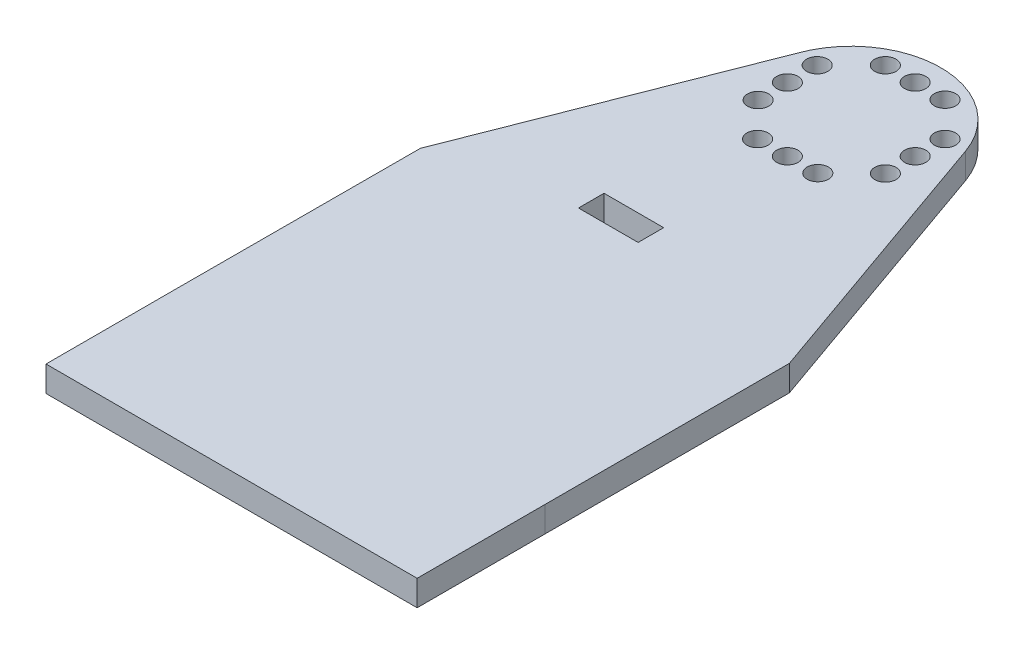
ISO-10303-21;
HEADER;
FILE_DESCRIPTION(('STEP AP214'),'2;1');
FILE_NAME('part.step','',(''),(''),'','','');
FILE_SCHEMA(('AUTOMOTIVE_DESIGN { 1 0 10303 214 1 1 1 1 }'));
ENDSEC;
DATA;
#1=APPLICATION_CONTEXT('core data for automotive mechanical design processes');
#2=APPLICATION_PROTOCOL_DEFINITION('international standard','automotive_design',2000,#1);
#3=PRODUCT_CONTEXT('',#1,'mechanical');
#4=PRODUCT('Part','Part','',(#3));
#5=PRODUCT_RELATED_PRODUCT_CATEGORY('part','',(#4));
#6=PRODUCT_DEFINITION_FORMATION('','',#4);
#7=PRODUCT_DEFINITION_CONTEXT('part definition',#1,'design');
#8=PRODUCT_DEFINITION('design','',#6,#7);
#9=PRODUCT_DEFINITION_SHAPE('','',#8);
#10=(LENGTH_UNIT() NAMED_UNIT(*) SI_UNIT(.MILLI.,.METRE.));
#11=(NAMED_UNIT(*) PLANE_ANGLE_UNIT() SI_UNIT($,.RADIAN.));
#12=(NAMED_UNIT(*) SI_UNIT($,.STERADIAN.) SOLID_ANGLE_UNIT());
#13=UNCERTAINTY_MEASURE_WITH_UNIT(LENGTH_MEASURE(1.E-05),#10,'distance_accuracy_value','');
#14=(GEOMETRIC_REPRESENTATION_CONTEXT(3) GLOBAL_UNCERTAINTY_ASSIGNED_CONTEXT((#13)) GLOBAL_UNIT_ASSIGNED_CONTEXT((#10,
#11,#12)) REPRESENTATION_CONTEXT('',''));
#15=CARTESIAN_POINT('',(0.,0.,0.));
#16=DIRECTION('',(0.,0.,1.));
#17=DIRECTION('',(1.,0.,0.));
#18=AXIS2_PLACEMENT_3D('',#15,#16,#17);
#19=CARTESIAN_POINT('',(0.,20.36,0.));
#20=DIRECTION('',(0.,-1.,0.));
#21=DIRECTION('',(0.,0.,1.));
#22=AXIS2_PLACEMENT_3D('',#19,#20,#21);
#23=PLANE('',#22);
#24=CARTESIAN_POINT('',(0.000138998678897145,20.36,7.48715701844329));
#25=DIRECTION('',(0.,1.,0.));
#26=DIRECTION('',(0.,0.,1.));
#27=AXIS2_PLACEMENT_3D('',#24,#25,#26);
#28=CIRCLE('',#27,1.25000000000284);
#29=CARTESIAN_POINT('',(0.000138998678897145,20.36,8.73715701844613));
#30=VERTEX_POINT('',#29);
#31=EDGE_CURVE('E277',#30,#30,#28,.T.);
#32=ORIENTED_EDGE('',*,*,#31,.F.);
#33=EDGE_LOOP('',(#32));
#34=FACE_BOUND('',#33,.T.);
#35=CARTESIAN_POINT('',(-7.4999892223201,20.36,-0.012714758365567));
#36=DIRECTION('',(0.,1.,0.));
#37=DIRECTION('',(0.,0.,1.));
#38=AXIS2_PLACEMENT_3D('',#35,#36,#37);
#39=CIRCLE('',#38,1.25);
#40=CARTESIAN_POINT('',(-7.4999892223201,20.36,1.23728524163443));
#41=VERTEX_POINT('',#40);
#42=EDGE_CURVE('E274',#41,#41,#39,.T.);
#43=ORIENTED_EDGE('',*,*,#42,.F.);
#44=EDGE_LOOP('',(#43));
#45=FACE_BOUND('',#44,.T.);
#46=CARTESIAN_POINT('',(-0.000117445511243577,20.36,-7.51284297936463));
#47=DIRECTION('',(0.,1.,0.));
#48=DIRECTION('',(0.,0.,1.));
#49=AXIS2_PLACEMENT_3D('',#46,#47,#48);
#50=CIRCLE('',#49,1.25000000000284);
#51=CARTESIAN_POINT('',(-0.000117445511243577,20.36,-6.26284297936179));
#52=VERTEX_POINT('',#51);
#53=EDGE_CURVE('E271',#52,#52,#50,.T.);
#54=ORIENTED_EDGE('',*,*,#53,.F.);
#55=EDGE_LOOP('',(#54));
#56=FACE_BOUND('',#55,.T.);
#57=CARTESIAN_POINT('',(7.50001077548777,20.36,-0.0129712025557176));
#58=DIRECTION('',(0.,1.,0.));
#59=DIRECTION('',(0.,0.,1.));
#60=AXIS2_PLACEMENT_3D('',#57,#58,#59);
#61=CIRCLE('',#60,1.25000000000284);
#62=CARTESIAN_POINT('',(7.50001077548777,20.36,1.23702879744713));
#63=VERTEX_POINT('',#62);
#64=EDGE_CURVE('E268',#63,#63,#61,.T.);
#65=ORIENTED_EDGE('',*,*,#64,.F.);
#66=EDGE_LOOP('',(#65));
#67=FACE_BOUND('',#66,.T.);
#68=CARTESIAN_POINT('',(-7.42819985023391,20.36,3.48654891933226));
#69=DIRECTION('',(0.,1.,0.));
#70=DIRECTION('',(0.,0.,1.));
#71=AXIS2_PLACEMENT_3D('',#68,#69,#70);
#72=CIRCLE('',#71,1.24999999999999);
#73=CARTESIAN_POINT('',(-7.42819985023391,20.36,4.73654891933225));
#74=VERTEX_POINT('',#73);
#75=EDGE_CURVE('E265',#74,#74,#72,.T.);
#76=ORIENTED_EDGE('',*,*,#75,.F.);
#77=EDGE_LOOP('',(#76));
#78=FACE_BOUND('',#77,.T.);
#79=CARTESIAN_POINT('',(-7.5000490592978,20.36,-3.5127147578541));
#80=DIRECTION('',(0.,1.,0.));
#81=DIRECTION('',(0.,0.,1.));
#82=AXIS2_PLACEMENT_3D('',#79,#80,#81);
#83=CIRCLE('',#82,1.25);
#84=CARTESIAN_POINT('',(-7.5000490592978,20.36,-2.2627147578541));
#85=VERTEX_POINT('',#84);
#86=EDGE_CURVE('E262',#85,#85,#83,.T.);
#87=ORIENTED_EDGE('',*,*,#86,.F.);
#88=EDGE_LOOP('',(#87));
#89=FACE_BOUND('',#88,.T.);
#90=CARTESIAN_POINT('',(-3.50011744499975,20.36,-7.51278314238694));
#91=DIRECTION('',(0.,1.,0.));
#92=DIRECTION('',(0.,0.,1.));
#93=AXIS2_PLACEMENT_3D('',#90,#91,#92);
#94=CIRCLE('',#93,1.25);
#95=CARTESIAN_POINT('',(-3.50011744499975,20.36,-6.26278314238694));
#96=VERTEX_POINT('',#95);
#97=EDGE_CURVE('E259',#96,#96,#94,.T.);
#98=ORIENTED_EDGE('',*,*,#97,.F.);
#99=EDGE_LOOP('',(#98));
#100=FACE_BOUND('',#99,.T.);
#101=CARTESIAN_POINT('',(3.49988255397726,20.36,-7.51290281634233));
#102=DIRECTION('',(0.,1.,0.));
#103=DIRECTION('',(0.,0.,1.));
#104=AXIS2_PLACEMENT_3D('',#101,#102,#103);
#105=CIRCLE('',#104,1.25);
#106=CARTESIAN_POINT('',(3.49988255397726,20.36,-6.26290281634233));
#107=VERTEX_POINT('',#106);
#108=EDGE_CURVE('E256',#107,#107,#105,.T.);
#109=ORIENTED_EDGE('',*,*,#108,.F.);
#110=EDGE_LOOP('',(#109));
#111=FACE_BOUND('',#110,.T.);
#112=CARTESIAN_POINT('',(7.50007061246547,20.36,-3.51297120204445));
#113=DIRECTION('',(0.,1.,0.));
#114=DIRECTION('',(0.,0.,1.));
#115=AXIS2_PLACEMENT_3D('',#112,#113,#114);
#116=CIRCLE('',#115,1.24999999999993);
#117=CARTESIAN_POINT('',(7.50007061246547,20.36,-2.26297120204451));
#118=VERTEX_POINT('',#117);
#119=EDGE_CURVE('E253',#118,#118,#116,.T.);
#120=ORIENTED_EDGE('',*,*,#119,.F.);
#121=EDGE_LOOP('',(#120));
#122=FACE_BOUND('',#121,.T.);
#123=CARTESIAN_POINT('',(7.50007061246547,20.36,3.48702879693279));
#124=DIRECTION('',(0.,1.,0.));
#125=DIRECTION('',(0.,0.,1.));
#126=AXIS2_PLACEMENT_3D('',#123,#124,#125);
#127=CIRCLE('',#126,1.25);
#128=CARTESIAN_POINT('',(7.50007061246547,20.36,4.73702879693279));
#129=VERTEX_POINT('',#128);
#130=EDGE_CURVE('E250',#129,#129,#127,.T.);
#131=ORIENTED_EDGE('',*,*,#130,.F.);
#132=EDGE_LOOP('',(#131));
#133=FACE_BOUND('',#132,.T.);
#134=CARTESIAN_POINT('',(-3.49986100080961,20.36,7.48721685542098));
#135=DIRECTION('',(0.,1.,0.));
#136=DIRECTION('',(0.,0.,1.));
#137=AXIS2_PLACEMENT_3D('',#134,#135,#136);
#138=CIRCLE('',#137,1.25);
#139=CARTESIAN_POINT('',(-3.49986100080961,20.36,8.73721685542098));
#140=VERTEX_POINT('',#139);
#141=EDGE_CURVE('E247',#140,#140,#138,.T.);
#142=ORIENTED_EDGE('',*,*,#141,.F.);
#143=EDGE_LOOP('',(#142));
#144=FACE_BOUND('',#143,.T.);
#145=CARTESIAN_POINT('',(3.49940267637675,20.36,7.4153676463571));
#146=DIRECTION('',(0.,1.,0.));
#147=DIRECTION('',(0.,0.,1.));
#148=AXIS2_PLACEMENT_3D('',#145,#146,#147);
#149=CIRCLE('',#148,1.25);
#150=CARTESIAN_POINT('',(3.49940267637675,20.36,8.6653676463571));
#151=VERTEX_POINT('',#150);
#152=EDGE_CURVE('E244',#151,#151,#149,.T.);
#153=ORIENTED_EDGE('',*,*,#152,.F.);
#154=EDGE_LOOP('',(#153));
#155=FACE_BOUND('',#154,.T.);
#156=DIRECTION('',(-2.31597558804307E-06,0.,0.999999999997318));
#157=VECTOR('',#156,1.);
#158=CARTESIAN_POINT('',(21.1626098440634,20.36,4.90120877782623E-05));
#159=LINE('',#158,#157);
#160=CARTESIAN_POINT('',(21.1625440363906,20.36,28.4147150215454));
#161=VERTEX_POINT('',#160);
#162=CARTESIAN_POINT('',(21.1624776148512,20.36,57.0944384809703));
#163=VERTEX_POINT('',#162);
#164=EDGE_CURVE('E231',#161,#163,#159,.T.);
#165=ORIENTED_EDGE('',*,*,#164,.F.);
#166=DIRECTION('',(-0.332026688593269,0.,-0.943269992134695));
#167=VECTOR('',#166,1.);
#168=CARTESIAN_POINT('',(9.9303210726443,20.36,-3.49542723706961));
#169=LINE('',#168,#167);
#170=CARTESIAN_POINT('',(9.92419125531912,20.36,-3.51284171891325));
#171=VERTEX_POINT('',#170);
#172=EDGE_CURVE('E233',#161,#171,#169,.T.);
#173=ORIENTED_EDGE('',*,*,#172,.T.);
#174=CARTESIAN_POINT('',(1.29236898960272E-13,20.36,1.6900543464704E-12));
#175=DIRECTION('',(0.,1.,0.));
#176=DIRECTION('',(0.,0.,1.));
#177=AXIS2_PLACEMENT_3D('',#174,#175,#176);
#178=CIRCLE('',#177,10.5275651987674);
#179=CARTESIAN_POINT('',(-9.92419125530451,20.36,-3.51284171895391));
#180=VERTEX_POINT('',#179);
#181=EDGE_CURVE('E236',#171,#180,#178,.T.);
#182=ORIENTED_EDGE('',*,*,#181,.T.);
#183=DIRECTION('',(0.364439204564198,0.,-0.931227182902548));
#184=VECTOR('',#183,1.);
#185=CARTESIAN_POINT('',(-9.79827362188853,20.36,-3.8345906460047));
#186=LINE('',#185,#184);
#187=CARTESIAN_POINT('',(-22.3398978909576,20.36,28.2121850324612));
#188=VERTEX_POINT('',#187);
#189=EDGE_CURVE('E238',#188,#180,#186,.T.);
#190=ORIENTED_EDGE('',*,*,#189,.F.);
#191=DIRECTION('',(0.0016808811872599,0.,-0.999998587318219));
#192=VECTOR('',#191,1.);
#193=CARTESIAN_POINT('',(-22.2924135085874,20.36,-0.0374709514197335));
#194=LINE('',#193,#192);
#195=CARTESIAN_POINT('',(-22.3884455960073,20.36,57.0944384809703));
#196=VERTEX_POINT('',#195);
#197=EDGE_CURVE('E241',#196,#188,#194,.T.);
#198=ORIENTED_EDGE('',*,*,#197,.F.);
#199=DIRECTION('',(0.,0.,-1.));
#200=VECTOR('',#199,1.);
#201=CARTESIAN_POINT('',(-22.3884455960073,20.36,72.0944384809703));
#202=LINE('',#201,#200);
#203=CARTESIAN_POINT('',(-22.3884455960073,20.36,72.0944384809703));
#204=VERTEX_POINT('',#203);
#205=EDGE_CURVE('E191',#204,#196,#202,.T.);
#206=ORIENTED_EDGE('',*,*,#205,.F.);
#207=DIRECTION('',(-1.,0.,0.));
#208=VECTOR('',#207,1.);
#209=CARTESIAN_POINT('',(-22.3884455960073,20.36,72.0944384809703));
#210=LINE('',#209,#208);
#211=CARTESIAN_POINT('',(21.1624776148512,20.36,72.0944384809703));
#212=VERTEX_POINT('',#211);
#213=EDGE_CURVE('E190',#212,#204,#210,.T.);
#214=ORIENTED_EDGE('',*,*,#213,.F.);
#215=DIRECTION('',(0.,0.,-1.));
#216=VECTOR('',#215,1.);
#217=CARTESIAN_POINT('',(21.1624776148512,20.36,72.0944384809703));
#218=LINE('',#217,#216);
#219=EDGE_CURVE('E195',#212,#163,#218,.T.);
#220=ORIENTED_EDGE('',*,*,#219,.T.);
#221=EDGE_LOOP('',(#165,#173,#182,#190,#198,#206,#214,#220));
#222=FACE_BOUND('',#221,.T.);
#223=DIRECTION('',(-1.,0.,0.));
#224=VECTOR('',#223,1.);
#225=CARTESIAN_POINT('',(0.,20.36,22.0000000000017));
#226=LINE('',#225,#224);
#227=CARTESIAN_POINT('',(1.29236898960272E-13,20.36,22.0000000000017));
#228=VERTEX_POINT('',#227);
#229=CARTESIAN_POINT('',(-7.,20.36,22.0000000000017));
#230=VERTEX_POINT('',#229);
#231=EDGE_CURVE('E181',#228,#230,#226,.T.);
#232=ORIENTED_EDGE('',*,*,#231,.F.);
#233=DIRECTION('',(0.,0.,1.));
#234=VECTOR('',#233,1.);
#235=CARTESIAN_POINT('',(1.29236898960272E-13,20.36,0.));
#236=LINE('',#235,#234);
#237=CARTESIAN_POINT('',(1.29236898960272E-13,20.36,25.0000000000017));
#238=VERTEX_POINT('',#237);
#239=EDGE_CURVE('E174',#228,#238,#236,.T.);
#240=ORIENTED_EDGE('',*,*,#239,.T.);
#241=DIRECTION('',(-1.,0.,0.));
#242=VECTOR('',#241,1.);
#243=CARTESIAN_POINT('',(0.,20.36,25.0000000000017));
#244=LINE('',#243,#242);
#245=CARTESIAN_POINT('',(-7.,20.36,25.0000000000017));
#246=VERTEX_POINT('',#245);
#247=EDGE_CURVE('E155',#238,#246,#244,.T.);
#248=ORIENTED_EDGE('',*,*,#247,.T.);
#249=DIRECTION('',(0.,0.,1.));
#250=VECTOR('',#249,1.);
#251=CARTESIAN_POINT('',(-7.,20.36,0.));
#252=LINE('',#251,#250);
#253=EDGE_CURVE('E179',#230,#246,#252,.T.);
#254=ORIENTED_EDGE('',*,*,#253,.F.);
#255=EDGE_LOOP('',(#232,#240,#248,#254));
#256=FACE_BOUND('',#255,.T.);
#257=ADVANCED_FACE('F34',(#34,#45,#56,#67,#78,#89,#100,#111,#122,#133,#144,#155,#222,#256),#23,.F.);
#258=CARTESIAN_POINT('',(0.,17.36,0.));
#259=DIRECTION('',(0.,-1.,0.));
#260=DIRECTION('',(0.,0.,1.));
#261=AXIS2_PLACEMENT_3D('',#258,#259,#260);
#262=PLANE('',#261);
#263=DIRECTION('',(0.,0.,1.));
#264=VECTOR('',#263,1.);
#265=CARTESIAN_POINT('',(-6.49999999999999,17.36,0.));
#266=LINE('',#265,#264);
#267=CARTESIAN_POINT('',(-6.5,17.36,27.9644392610414));
#268=VERTEX_POINT('',#267);
#269=CARTESIAN_POINT('',(-6.5,17.36,57.0944384809703));
#270=VERTEX_POINT('',#269);
#271=EDGE_CURVE('E330',#268,#270,#266,.T.);
#272=ORIENTED_EDGE('',*,*,#271,.T.);
#273=DIRECTION('',(1.,0.,0.));
#274=VECTOR('',#273,1.);
#275=CARTESIAN_POINT('',(-22.3884455960073,17.36,57.0944384809703));
#276=LINE('',#275,#274);
#277=CARTESIAN_POINT('',(-3.5,17.36,57.0944384809703));
#278=VERTEX_POINT('',#277);
#279=EDGE_CURVE('E11',#270,#278,#276,.T.);
#280=ORIENTED_EDGE('',*,*,#279,.T.);
#281=DIRECTION('',(0.,0.,-1.));
#282=VECTOR('',#281,1.);
#283=CARTESIAN_POINT('',(-3.5,17.36,0.));
#284=LINE('',#283,#282);
#285=CARTESIAN_POINT('',(-3.5,17.36,27.9644392610414));
#286=VERTEX_POINT('',#285);
#287=EDGE_CURVE('E43',#278,#286,#284,.T.);
#288=ORIENTED_EDGE('',*,*,#287,.T.);
#289=DIRECTION('',(-1.,0.,0.));
#290=VECTOR('',#289,1.);
#291=CARTESIAN_POINT('',(0.,17.36,27.9644392610414));
#292=LINE('',#291,#290);
#293=EDGE_CURVE('E347',#286,#268,#292,.T.);
#294=ORIENTED_EDGE('',*,*,#293,.T.);
#295=EDGE_LOOP('',(#272,#280,#288,#294));
#296=FACE_BOUND('',#295,.T.);
#297=DIRECTION('',(0.,0.,-1.));
#298=VECTOR('',#297,1.);
#299=CARTESIAN_POINT('',(-22.3884455960073,17.36,72.0944384809703));
#300=LINE('',#299,#298);
#301=CARTESIAN_POINT('',(-22.3884455960073,17.36,72.0944384809703));
#302=VERTEX_POINT('',#301);
#303=CARTESIAN_POINT('',(-22.3884455960073,17.36,57.0944384809703));
#304=VERTEX_POINT('',#303);
#305=EDGE_CURVE('E201',#302,#304,#300,.T.);
#306=ORIENTED_EDGE('',*,*,#305,.T.);
#307=DIRECTION('',(0.0016808811872599,0.,-0.999998587318219));
#308=VECTOR('',#307,1.);
#309=CARTESIAN_POINT('',(-22.2924135085874,17.36,-0.0374709514197335));
#310=LINE('',#309,#308);
#311=CARTESIAN_POINT('',(-22.3398978909576,17.36,28.2121850324612));
#312=VERTEX_POINT('',#311);
#313=EDGE_CURVE('E289',#304,#312,#310,.T.);
#314=ORIENTED_EDGE('',*,*,#313,.T.);
#315=DIRECTION('',(0.364439204564198,0.,-0.931227182902548));
#316=VECTOR('',#315,1.);
#317=CARTESIAN_POINT('',(-9.79827362188853,17.36,-3.8345906460047));
#318=LINE('',#317,#316);
#319=CARTESIAN_POINT('',(-9.92419125530451,17.36,-3.51284171895391));
#320=VERTEX_POINT('',#319);
#321=EDGE_CURVE('E286',#312,#320,#318,.T.);
#322=ORIENTED_EDGE('',*,*,#321,.T.);
#323=CARTESIAN_POINT('',(1.29236898960272E-13,17.36,1.6900543464704E-12));
#324=DIRECTION('',(0.,1.,0.));
#325=DIRECTION('',(0.,0.,1.));
#326=AXIS2_PLACEMENT_3D('',#323,#324,#325);
#327=CIRCLE('',#326,10.5275651987674);
#328=CARTESIAN_POINT('',(9.92419125531912,17.36,-3.51284171891325));
#329=VERTEX_POINT('',#328);
#330=EDGE_CURVE('E284',#329,#320,#327,.T.);
#331=ORIENTED_EDGE('',*,*,#330,.F.);
#332=DIRECTION('',(-0.332026688593269,0.,-0.943269992134695));
#333=VECTOR('',#332,1.);
#334=CARTESIAN_POINT('',(9.9303210726443,17.36,-3.49542723706961));
#335=LINE('',#334,#333);
#336=CARTESIAN_POINT('',(21.1625440363906,17.36,28.4147150215454));
#337=VERTEX_POINT('',#336);
#338=EDGE_CURVE('E282',#337,#329,#335,.T.);
#339=ORIENTED_EDGE('',*,*,#338,.F.);
#340=DIRECTION('',(-2.31597558804307E-06,0.,0.999999999997318));
#341=VECTOR('',#340,1.);
#342=CARTESIAN_POINT('',(21.1626098440634,17.36,4.90120877782623E-05));
#343=LINE('',#342,#341);
#344=CARTESIAN_POINT('',(21.1624776148512,17.36,57.0944384809703));
#345=VERTEX_POINT('',#344);
#346=EDGE_CURVE('E224',#337,#345,#343,.T.);
#347=ORIENTED_EDGE('',*,*,#346,.T.);
#348=DIRECTION('',(0.,0.,-1.));
#349=VECTOR('',#348,1.);
#350=CARTESIAN_POINT('',(21.1624776148512,17.36,72.0944384809703));
#351=LINE('',#350,#349);
#352=CARTESIAN_POINT('',(21.1624776148512,17.36,72.0944384809703));
#353=VERTEX_POINT('',#352);
#354=EDGE_CURVE('E198',#353,#345,#351,.T.);
#355=ORIENTED_EDGE('',*,*,#354,.F.);
#356=DIRECTION('',(1.,0.,0.));
#357=VECTOR('',#356,1.);
#358=CARTESIAN_POINT('',(-22.3884455960073,17.36,72.0944384809703));
#359=LINE('',#358,#357);
#360=EDGE_CURVE('E186',#302,#353,#359,.T.);
#361=ORIENTED_EDGE('',*,*,#360,.F.);
#362=EDGE_LOOP('',(#306,#314,#322,#331,#339,#347,#355,#361));
#363=FACE_BOUND('',#362,.T.);
#364=CARTESIAN_POINT('',(3.49940267637675,17.36,7.4153676463571));
#365=DIRECTION('',(0.,1.,0.));
#366=DIRECTION('',(0.,0.,1.));
#367=AXIS2_PLACEMENT_3D('',#364,#365,#366);
#368=CIRCLE('',#367,1.25);
#369=CARTESIAN_POINT('',(3.49940267637675,17.36,8.6653676463571));
#370=VERTEX_POINT('',#369);
#371=EDGE_CURVE('E292',#370,#370,#368,.T.);
#372=ORIENTED_EDGE('',*,*,#371,.T.);
#373=EDGE_LOOP('',(#372));
#374=FACE_BOUND('',#373,.T.);
#375=CARTESIAN_POINT('',(-3.49986100080961,17.36,7.48721685542098));
#376=DIRECTION('',(0.,1.,0.));
#377=DIRECTION('',(0.,0.,1.));
#378=AXIS2_PLACEMENT_3D('',#375,#376,#377);
#379=CIRCLE('',#378,1.25);
#380=CARTESIAN_POINT('',(-3.49986100080961,17.36,8.73721685542098));
#381=VERTEX_POINT('',#380);
#382=EDGE_CURVE('E295',#381,#381,#379,.T.);
#383=ORIENTED_EDGE('',*,*,#382,.T.);
#384=EDGE_LOOP('',(#383));
#385=FACE_BOUND('',#384,.T.);
#386=CARTESIAN_POINT('',(7.50007061246547,17.36,3.48702879693279));
#387=DIRECTION('',(0.,1.,0.));
#388=DIRECTION('',(0.,0.,1.));
#389=AXIS2_PLACEMENT_3D('',#386,#387,#388);
#390=CIRCLE('',#389,1.25);
#391=CARTESIAN_POINT('',(7.50007061246547,17.36,4.73702879693279));
#392=VERTEX_POINT('',#391);
#393=EDGE_CURVE('E298',#392,#392,#390,.T.);
#394=ORIENTED_EDGE('',*,*,#393,.T.);
#395=EDGE_LOOP('',(#394));
#396=FACE_BOUND('',#395,.T.);
#397=CARTESIAN_POINT('',(7.50007061246547,17.36,-3.51297120204445));
#398=DIRECTION('',(0.,1.,0.));
#399=DIRECTION('',(0.,0.,1.));
#400=AXIS2_PLACEMENT_3D('',#397,#398,#399);
#401=CIRCLE('',#400,1.24999999999993);
#402=CARTESIAN_POINT('',(7.50007061246547,17.36,-2.26297120204451));
#403=VERTEX_POINT('',#402);
#404=EDGE_CURVE('E301',#403,#403,#401,.T.);
#405=ORIENTED_EDGE('',*,*,#404,.T.);
#406=EDGE_LOOP('',(#405));
#407=FACE_BOUND('',#406,.T.);
#408=CARTESIAN_POINT('',(3.49988255397726,17.36,-7.51290281634233));
#409=DIRECTION('',(0.,1.,0.));
#410=DIRECTION('',(0.,0.,1.));
#411=AXIS2_PLACEMENT_3D('',#408,#409,#410);
#412=CIRCLE('',#411,1.25);
#413=CARTESIAN_POINT('',(3.49988255397726,17.36,-6.26290281634233));
#414=VERTEX_POINT('',#413);
#415=EDGE_CURVE('E304',#414,#414,#412,.T.);
#416=ORIENTED_EDGE('',*,*,#415,.T.);
#417=EDGE_LOOP('',(#416));
#418=FACE_BOUND('',#417,.T.);
#419=CARTESIAN_POINT('',(-3.50011744499975,17.36,-7.51278314238694));
#420=DIRECTION('',(0.,1.,0.));
#421=DIRECTION('',(0.,0.,1.));
#422=AXIS2_PLACEMENT_3D('',#419,#420,#421);
#423=CIRCLE('',#422,1.25);
#424=CARTESIAN_POINT('',(-3.50011744499975,17.36,-6.26278314238694));
#425=VERTEX_POINT('',#424);
#426=EDGE_CURVE('E307',#425,#425,#423,.T.);
#427=ORIENTED_EDGE('',*,*,#426,.T.);
#428=EDGE_LOOP('',(#427));
#429=FACE_BOUND('',#428,.T.);
#430=CARTESIAN_POINT('',(-7.5000490592978,17.36,-3.5127147578541));
#431=DIRECTION('',(0.,1.,0.));
#432=DIRECTION('',(0.,0.,1.));
#433=AXIS2_PLACEMENT_3D('',#430,#431,#432);
#434=CIRCLE('',#433,1.25);
#435=CARTESIAN_POINT('',(-7.5000490592978,17.36,-2.2627147578541));
#436=VERTEX_POINT('',#435);
#437=EDGE_CURVE('E310',#436,#436,#434,.T.);
#438=ORIENTED_EDGE('',*,*,#437,.T.);
#439=EDGE_LOOP('',(#438));
#440=FACE_BOUND('',#439,.T.);
#441=CARTESIAN_POINT('',(-7.42819985023391,17.36,3.48654891933226));
#442=DIRECTION('',(0.,1.,0.));
#443=DIRECTION('',(0.,0.,1.));
#444=AXIS2_PLACEMENT_3D('',#441,#442,#443);
#445=CIRCLE('',#444,1.24999999999999);
#446=CARTESIAN_POINT('',(-7.42819985023391,17.36,4.73654891933225));
#447=VERTEX_POINT('',#446);
#448=EDGE_CURVE('E313',#447,#447,#445,.T.);
#449=ORIENTED_EDGE('',*,*,#448,.T.);
#450=EDGE_LOOP('',(#449));
#451=FACE_BOUND('',#450,.T.);
#452=CARTESIAN_POINT('',(7.50001077548777,17.36,-0.0129712025557176));
#453=DIRECTION('',(0.,1.,0.));
#454=DIRECTION('',(0.,0.,1.));
#455=AXIS2_PLACEMENT_3D('',#452,#453,#454);
#456=CIRCLE('',#455,1.25000000000284);
#457=CARTESIAN_POINT('',(7.50001077548777,17.36,1.23702879744713));
#458=VERTEX_POINT('',#457);
#459=EDGE_CURVE('E316',#458,#458,#456,.T.);
#460=ORIENTED_EDGE('',*,*,#459,.T.);
#461=EDGE_LOOP('',(#460));
#462=FACE_BOUND('',#461,.T.);
#463=CARTESIAN_POINT('',(-0.000117445511243577,17.36,-7.51284297936463));
#464=DIRECTION('',(0.,1.,0.));
#465=DIRECTION('',(0.,0.,1.));
#466=AXIS2_PLACEMENT_3D('',#463,#464,#465);
#467=CIRCLE('',#466,1.25000000000284);
#468=CARTESIAN_POINT('',(-0.000117445511243577,17.36,-6.26284297936179));
#469=VERTEX_POINT('',#468);
#470=EDGE_CURVE('E319',#469,#469,#467,.T.);
#471=ORIENTED_EDGE('',*,*,#470,.T.);
#472=EDGE_LOOP('',(#471));
#473=FACE_BOUND('',#472,.T.);
#474=CARTESIAN_POINT('',(-7.4999892223201,17.36,-0.012714758365567));
#475=DIRECTION('',(0.,1.,0.));
#476=DIRECTION('',(0.,0.,1.));
#477=AXIS2_PLACEMENT_3D('',#474,#475,#476);
#478=CIRCLE('',#477,1.25);
#479=CARTESIAN_POINT('',(-7.4999892223201,17.36,1.23728524163443));
#480=VERTEX_POINT('',#479);
#481=EDGE_CURVE('E322',#480,#480,#478,.T.);
#482=ORIENTED_EDGE('',*,*,#481,.T.);
#483=EDGE_LOOP('',(#482));
#484=FACE_BOUND('',#483,.T.);
#485=CARTESIAN_POINT('',(0.000138998678897145,17.36,7.48715701844329));
#486=DIRECTION('',(0.,1.,0.));
#487=DIRECTION('',(0.,0.,1.));
#488=AXIS2_PLACEMENT_3D('',#485,#486,#487);
#489=CIRCLE('',#488,1.25000000000284);
#490=CARTESIAN_POINT('',(0.000138998678897145,17.36,8.73715701844613));
#491=VERTEX_POINT('',#490);
#492=EDGE_CURVE('E234',#491,#491,#489,.T.);
#493=ORIENTED_EDGE('',*,*,#492,.T.);
#494=EDGE_LOOP('',(#493));
#495=FACE_BOUND('',#494,.T.);
#496=DIRECTION('',(0.,0.,1.));
#497=VECTOR('',#496,1.);
#498=CARTESIAN_POINT('',(1.29236898960272E-13,17.36,0.));
#499=LINE('',#498,#497);
#500=CARTESIAN_POINT('',(1.29236898960272E-13,17.36,22.0000000000017));
#501=VERTEX_POINT('',#500);
#502=CARTESIAN_POINT('',(1.29236898960272E-13,17.36,25.0000000000017));
#503=VERTEX_POINT('',#502);
#504=EDGE_CURVE('E161',#501,#503,#499,.T.);
#505=ORIENTED_EDGE('',*,*,#504,.F.);
#506=DIRECTION('',(-1.,0.,0.));
#507=VECTOR('',#506,1.);
#508=CARTESIAN_POINT('',(0.,17.36,22.0000000000017));
#509=LINE('',#508,#507);
#510=CARTESIAN_POINT('',(-7.,17.36,22.0000000000017));
#511=VERTEX_POINT('',#510);
#512=EDGE_CURVE('E59',#501,#511,#509,.T.);
#513=ORIENTED_EDGE('',*,*,#512,.T.);
#514=DIRECTION('',(0.,0.,1.));
#515=VECTOR('',#514,1.);
#516=CARTESIAN_POINT('',(-7.,17.36,0.));
#517=LINE('',#516,#515);
#518=CARTESIAN_POINT('',(-7.,17.36,25.0000000000017));
#519=VERTEX_POINT('',#518);
#520=EDGE_CURVE('E167',#511,#519,#517,.T.);
#521=ORIENTED_EDGE('',*,*,#520,.T.);
#522=DIRECTION('',(-1.,0.,0.));
#523=VECTOR('',#522,1.);
#524=CARTESIAN_POINT('',(0.,17.36,25.0000000000017));
#525=LINE('',#524,#523);
#526=EDGE_CURVE('E152',#503,#519,#525,.T.);
#527=ORIENTED_EDGE('',*,*,#526,.F.);
#528=EDGE_LOOP('',(#505,#513,#521,#527));
#529=FACE_BOUND('',#528,.T.);
#530=ADVANCED_FACE('F165',(#296,#363,#374,#385,#396,#407,#418,#429,#440,#451,#462,#473,#484,
#495,#529),#262,.T.);
#531=CARTESIAN_POINT('',(21.1626098440634,20.36,4.90120877782623E-05));
#532=DIRECTION('',(-0.999999999997318,0.,-2.31597558804307E-06));
#533=DIRECTION('',(-2.31597558804307E-06,0.,0.999999999997318));
#534=AXIS2_PLACEMENT_3D('',#531,#532,#533);
#535=PLANE('',#534);
#536=ORIENTED_EDGE('',*,*,#346,.F.);
#537=DIRECTION('',(0.,-1.,0.));
#538=VECTOR('',#537,1.);
#539=CARTESIAN_POINT('',(21.1625440363906,20.36,28.4147150215454));
#540=LINE('',#539,#538);
#541=EDGE_CURVE('E280',#161,#337,#540,.T.);
#542=ORIENTED_EDGE('',*,*,#541,.F.);
#543=ORIENTED_EDGE('',*,*,#164,.T.);
#544=DIRECTION('',(0.,-1.,0.));
#545=VECTOR('',#544,1.);
#546=CARTESIAN_POINT('',(21.1624776148512,20.36,57.0944384809703));
#547=LINE('',#546,#545);
#548=EDGE_CURVE('E327',#163,#345,#547,.T.);
#549=ORIENTED_EDGE('',*,*,#548,.T.);
#550=EDGE_LOOP('',(#536,#542,#543,#549));
#551=FACE_BOUND('',#550,.T.);
#552=ADVANCED_FACE('F36',(#551),#535,.F.);
#553=CARTESIAN_POINT('',(0.,20.36,57.0944384809703));
#554=DIRECTION('',(0.,0.,1.));
#555=DIRECTION('',(1.,0.,0.));
#556=AXIS2_PLACEMENT_3D('',#553,#554,#555);
#557=PLANE('',#556);
#558=ORIENTED_EDGE('',*,*,#279,.F.);
#559=DIRECTION('',(0.,1.,0.));
#560=VECTOR('',#559,1.);
#561=CARTESIAN_POINT('',(-6.5,8.68,57.0944384809703));
#562=LINE('',#561,#560);
#563=CARTESIAN_POINT('',(-6.5,8.68,57.0944384809703));
#564=VERTEX_POINT('',#563);
#565=EDGE_CURVE('E220',#564,#270,#562,.T.);
#566=ORIENTED_EDGE('',*,*,#565,.F.);
#567=DIRECTION('',(-1.,0.,0.));
#568=VECTOR('',#567,1.);
#569=CARTESIAN_POINT('',(-3.5,8.68,57.0944384809703));
#570=LINE('',#569,#568);
#571=CARTESIAN_POINT('',(-3.5,8.68,57.0944384809703));
#572=VERTEX_POINT('',#571);
#573=EDGE_CURVE('E211',#572,#564,#570,.T.);
#574=ORIENTED_EDGE('',*,*,#573,.F.);
#575=DIRECTION('',(0.,1.,0.));
#576=VECTOR('',#575,1.);
#577=CARTESIAN_POINT('',(-3.5,8.68,57.0944384809703));
#578=LINE('',#577,#576);
#579=EDGE_CURVE('E221',#572,#278,#578,.T.);
#580=ORIENTED_EDGE('',*,*,#579,.T.);
#581=EDGE_LOOP('',(#558,#566,#574,#580));
#582=FACE_BOUND('',#581,.T.);
#583=ADVANCED_FACE('F377',(#582),#557,.T.);
#584=CARTESIAN_POINT('',(-22.2924135085874,20.36,-0.0374709514197335));
#585=DIRECTION('',(0.999998587318219,0.,0.0016808811872599));
#586=DIRECTION('',(0.0016808811872599,0.,-0.999998587318219));
#587=AXIS2_PLACEMENT_3D('',#584,#585,#586);
#588=PLANE('',#587);
#589=ORIENTED_EDGE('',*,*,#313,.F.);
#590=DIRECTION('',(0.,-1.,0.));
#591=VECTOR('',#590,1.);
#592=CARTESIAN_POINT('',(-22.3884455960073,20.36,57.0944384809703));
#593=LINE('',#592,#591);
#594=EDGE_CURVE('E331',#196,#304,#593,.T.);
#595=ORIENTED_EDGE('',*,*,#594,.F.);
#596=ORIENTED_EDGE('',*,*,#197,.T.);
#597=DIRECTION('',(0.,-1.,0.));
#598=VECTOR('',#597,1.);
#599=CARTESIAN_POINT('',(-22.3398978909576,20.36,28.2121850324612));
#600=LINE('',#599,#598);
#601=EDGE_CURVE('E334',#188,#312,#600,.T.);
#602=ORIENTED_EDGE('',*,*,#601,.T.);
#603=EDGE_LOOP('',(#589,#595,#596,#602));
#604=FACE_BOUND('',#603,.T.);
#605=ADVANCED_FACE('F458',(#604),#588,.F.);
#606=CARTESIAN_POINT('',(-9.79827362188853,20.36,-3.8345906460047));
#607=DIRECTION('',(0.931227182902547,0.,0.364439204564198));
#608=DIRECTION('',(0.364439204564198,0.,-0.931227182902548));
#609=AXIS2_PLACEMENT_3D('',#606,#607,#608);
#610=PLANE('',#609);
#611=ORIENTED_EDGE('',*,*,#321,.F.);
#612=ORIENTED_EDGE('',*,*,#601,.F.);
#613=ORIENTED_EDGE('',*,*,#189,.T.);
#614=DIRECTION('',(0.,-1.,0.));
#615=VECTOR('',#614,1.);
#616=CARTESIAN_POINT('',(-9.92419125530451,20.36,-3.51284171895391));
#617=LINE('',#616,#615);
#618=EDGE_CURVE('E337',#180,#320,#617,.T.);
#619=ORIENTED_EDGE('',*,*,#618,.T.);
#620=EDGE_LOOP('',(#611,#612,#613,#619));
#621=FACE_BOUND('',#620,.T.);
#622=ADVANCED_FACE('F461',(#621),#610,.F.);
#623=CARTESIAN_POINT('',(1.29236898960272E-13,20.36,1.6900543464704E-12));
#624=DIRECTION('',(0.,-1.,0.));
#625=DIRECTION('',(0.,0.,1.));
#626=AXIS2_PLACEMENT_3D('',#623,#624,#625);
#627=CYLINDRICAL_SURFACE('',#626,10.5275651987674);
#628=ORIENTED_EDGE('',*,*,#330,.T.);
#629=ORIENTED_EDGE('',*,*,#618,.F.);
#630=ORIENTED_EDGE('',*,*,#181,.F.);
#631=DIRECTION('',(0.,-1.,0.));
#632=VECTOR('',#631,1.);
#633=CARTESIAN_POINT('',(9.92419125531912,20.36,-3.51284171891325));
#634=LINE('',#633,#632);
#635=EDGE_CURVE('E340',#171,#329,#634,.T.);
#636=ORIENTED_EDGE('',*,*,#635,.T.);
#637=EDGE_LOOP('',(#628,#629,#630,#636));
#638=FACE_BOUND('',#637,.T.);
#639=ADVANCED_FACE('F415',(#638),#627,.T.);
#640=CARTESIAN_POINT('',(-7.4999892223201,20.36,-0.012714758365567));
#641=DIRECTION('',(0.,-1.,0.));
#642=DIRECTION('',(0.,0.,1.));
#643=AXIS2_PLACEMENT_3D('',#640,#641,#642);
#644=CYLINDRICAL_SURFACE('',#643,1.25);
#645=ORIENTED_EDGE('',*,*,#42,.T.);
#646=EDGE_LOOP('',(#645));
#647=FACE_BOUND('',#646,.T.);
#648=ORIENTED_EDGE('',*,*,#481,.F.);
#649=EDGE_LOOP('',(#648));
#650=FACE_BOUND('',#649,.T.);
#651=ADVANCED_FACE('F411',(#647,#650),#644,.F.);
#652=CARTESIAN_POINT('',(-0.000117445511243577,20.36,-7.51284297936463));
#653=DIRECTION('',(0.,-1.,0.));
#654=DIRECTION('',(0.,0.,1.));
#655=AXIS2_PLACEMENT_3D('',#652,#653,#654);
#656=CYLINDRICAL_SURFACE('',#655,1.25000000000284);
#657=ORIENTED_EDGE('',*,*,#53,.T.);
#658=EDGE_LOOP('',(#657));
#659=FACE_BOUND('',#658,.T.);
#660=ORIENTED_EDGE('',*,*,#470,.F.);
#661=EDGE_LOOP('',(#660));
#662=FACE_BOUND('',#661,.T.);
#663=ADVANCED_FACE('F414',(#659,#662),#656,.F.);
#664=CARTESIAN_POINT('',(7.50001077548777,20.36,-0.0129712025557176));
#665=DIRECTION('',(0.,-1.,0.));
#666=DIRECTION('',(0.,0.,1.));
#667=AXIS2_PLACEMENT_3D('',#664,#665,#666);
#668=CYLINDRICAL_SURFACE('',#667,1.25000000000284);
#669=ORIENTED_EDGE('',*,*,#64,.T.);
#670=EDGE_LOOP('',(#669));
#671=FACE_BOUND('',#670,.T.);
#672=ORIENTED_EDGE('',*,*,#459,.F.);
#673=EDGE_LOOP('',(#672));
#674=FACE_BOUND('',#673,.T.);
#675=ADVANCED_FACE('F419',(#671,#674),#668,.F.);
#676=CARTESIAN_POINT('',(-7.42819985023391,20.36,3.48654891933226));
#677=DIRECTION('',(0.,-1.,0.));
#678=DIRECTION('',(0.,0.,1.));
#679=AXIS2_PLACEMENT_3D('',#676,#677,#678);
#680=CYLINDRICAL_SURFACE('',#679,1.24999999999999);
#681=ORIENTED_EDGE('',*,*,#75,.T.);
#682=EDGE_LOOP('',(#681));
#683=FACE_BOUND('',#682,.T.);
#684=ORIENTED_EDGE('',*,*,#448,.F.);
#685=EDGE_LOOP('',(#684));
#686=FACE_BOUND('',#685,.T.);
#687=ADVANCED_FACE('F423',(#683,#686),#680,.F.);
#688=CARTESIAN_POINT('',(-7.5000490592978,20.36,-3.5127147578541));
#689=DIRECTION('',(0.,-1.,0.));
#690=DIRECTION('',(0.,0.,1.));
#691=AXIS2_PLACEMENT_3D('',#688,#689,#690);
#692=CYLINDRICAL_SURFACE('',#691,1.25);
#693=ORIENTED_EDGE('',*,*,#86,.T.);
#694=EDGE_LOOP('',(#693));
#695=FACE_BOUND('',#694,.T.);
#696=ORIENTED_EDGE('',*,*,#437,.F.);
#697=EDGE_LOOP('',(#696));
#698=FACE_BOUND('',#697,.T.);
#699=ADVANCED_FACE('F427',(#695,#698),#692,.F.);
#700=CARTESIAN_POINT('',(-3.50011744499975,20.36,-7.51278314238694));
#701=DIRECTION('',(0.,-1.,0.));
#702=DIRECTION('',(0.,0.,1.));
#703=AXIS2_PLACEMENT_3D('',#700,#701,#702);
#704=CYLINDRICAL_SURFACE('',#703,1.25);
#705=ORIENTED_EDGE('',*,*,#97,.T.);
#706=EDGE_LOOP('',(#705));
#707=FACE_BOUND('',#706,.T.);
#708=ORIENTED_EDGE('',*,*,#426,.F.);
#709=EDGE_LOOP('',(#708));
#710=FACE_BOUND('',#709,.T.);
#711=ADVANCED_FACE('F431',(#707,#710),#704,.F.);
#712=CARTESIAN_POINT('',(3.49988255397726,20.36,-7.51290281634233));
#713=DIRECTION('',(0.,-1.,0.));
#714=DIRECTION('',(0.,0.,1.));
#715=AXIS2_PLACEMENT_3D('',#712,#713,#714);
#716=CYLINDRICAL_SURFACE('',#715,1.25);
#717=ORIENTED_EDGE('',*,*,#108,.T.);
#718=EDGE_LOOP('',(#717));
#719=FACE_BOUND('',#718,.T.);
#720=ORIENTED_EDGE('',*,*,#415,.F.);
#721=EDGE_LOOP('',(#720));
#722=FACE_BOUND('',#721,.T.);
#723=ADVANCED_FACE('F435',(#719,#722),#716,.F.);
#724=CARTESIAN_POINT('',(7.50007061246547,20.36,-3.51297120204445));
#725=DIRECTION('',(0.,-1.,0.));
#726=DIRECTION('',(0.,0.,1.));
#727=AXIS2_PLACEMENT_3D('',#724,#725,#726);
#728=CYLINDRICAL_SURFACE('',#727,1.24999999999993);
#729=ORIENTED_EDGE('',*,*,#119,.T.);
#730=EDGE_LOOP('',(#729));
#731=FACE_BOUND('',#730,.T.);
#732=ORIENTED_EDGE('',*,*,#404,.F.);
#733=EDGE_LOOP('',(#732));
#734=FACE_BOUND('',#733,.T.);
#735=ADVANCED_FACE('F439',(#731,#734),#728,.F.);
#736=CARTESIAN_POINT('',(7.50007061246547,20.36,3.48702879693279));
#737=DIRECTION('',(0.,-1.,0.));
#738=DIRECTION('',(0.,0.,1.));
#739=AXIS2_PLACEMENT_3D('',#736,#737,#738);
#740=CYLINDRICAL_SURFACE('',#739,1.25);
#741=ORIENTED_EDGE('',*,*,#130,.T.);
#742=EDGE_LOOP('',(#741));
#743=FACE_BOUND('',#742,.T.);
#744=ORIENTED_EDGE('',*,*,#393,.F.);
#745=EDGE_LOOP('',(#744));
#746=FACE_BOUND('',#745,.T.);
#747=ADVANCED_FACE('F443',(#743,#746),#740,.F.);
#748=CARTESIAN_POINT('',(-3.49986100080961,20.36,7.48721685542098));
#749=DIRECTION('',(0.,-1.,0.));
#750=DIRECTION('',(0.,0.,1.));
#751=AXIS2_PLACEMENT_3D('',#748,#749,#750);
#752=CYLINDRICAL_SURFACE('',#751,1.25);
#753=ORIENTED_EDGE('',*,*,#141,.T.);
#754=EDGE_LOOP('',(#753));
#755=FACE_BOUND('',#754,.T.);
#756=ORIENTED_EDGE('',*,*,#382,.F.);
#757=EDGE_LOOP('',(#756));
#758=FACE_BOUND('',#757,.T.);
#759=ADVANCED_FACE('F447',(#755,#758),#752,.F.);
#760=CARTESIAN_POINT('',(3.49940267637675,20.36,7.4153676463571));
#761=DIRECTION('',(0.,-1.,0.));
#762=DIRECTION('',(0.,0.,1.));
#763=AXIS2_PLACEMENT_3D('',#760,#761,#762);
#764=CYLINDRICAL_SURFACE('',#763,1.25);
#765=ORIENTED_EDGE('',*,*,#152,.T.);
#766=EDGE_LOOP('',(#765));
#767=FACE_BOUND('',#766,.T.);
#768=ORIENTED_EDGE('',*,*,#371,.F.);
#769=EDGE_LOOP('',(#768));
#770=FACE_BOUND('',#769,.T.);
#771=ADVANCED_FACE('F451',(#767,#770),#764,.F.);
#772=CARTESIAN_POINT('',(9.9303210726443,20.36,-3.49542723706961));
#773=DIRECTION('',(0.943269992134695,0.,-0.332026688593269));
#774=DIRECTION('',(-0.332026688593269,0.,-0.943269992134696));
#775=AXIS2_PLACEMENT_3D('',#772,#773,#774);
#776=PLANE('',#775);
#777=ORIENTED_EDGE('',*,*,#338,.T.);
#778=ORIENTED_EDGE('',*,*,#635,.F.);
#779=ORIENTED_EDGE('',*,*,#172,.F.);
#780=ORIENTED_EDGE('',*,*,#541,.T.);
#781=EDGE_LOOP('',(#777,#778,#779,#780));
#782=FACE_BOUND('',#781,.T.);
#783=ADVANCED_FACE('F409',(#782),#776,.T.);
#784=CARTESIAN_POINT('',(0.000138998678897145,20.36,7.48715701844329));
#785=DIRECTION('',(0.,-1.,0.));
#786=DIRECTION('',(0.,0.,1.));
#787=AXIS2_PLACEMENT_3D('',#784,#785,#786);
#788=CYLINDRICAL_SURFACE('',#787,1.25000000000284);
#789=ORIENTED_EDGE('',*,*,#31,.T.);
#790=EDGE_LOOP('',(#789));
#791=FACE_BOUND('',#790,.T.);
#792=ORIENTED_EDGE('',*,*,#492,.F.);
#793=EDGE_LOOP('',(#792));
#794=FACE_BOUND('',#793,.T.);
#795=ADVANCED_FACE('F369',(#791,#794),#788,.F.);
#796=CARTESIAN_POINT('',(-3.5,8.68,27.9644392610414));
#797=DIRECTION('',(1.,0.,0.));
#798=DIRECTION('',(0.,0.,-1.));
#799=AXIS2_PLACEMENT_3D('',#796,#797,#798);
#800=PLANE('',#799);
#801=CARTESIAN_POINT('',(-3.5,13.48,47.7194392610414));
#802=DIRECTION('',(-1.,0.,0.));
#803=DIRECTION('',(0.,0.,-1.));
#804=AXIS2_PLACEMENT_3D('',#801,#802,#803);
#805=CIRCLE('',#804,1.75);
#806=CARTESIAN_POINT('',(-3.5,13.48,45.9694392610414));
#807=VERTEX_POINT('',#806);
#808=EDGE_CURVE('E204',#807,#807,#805,.T.);
#809=ORIENTED_EDGE('',*,*,#808,.T.);
#810=EDGE_LOOP('',(#809));
#811=FACE_BOUND('',#810,.T.);
#812=CARTESIAN_POINT('',(-3.5,13.48,37.3694392610414));
#813=DIRECTION('',(-1.,0.,0.));
#814=DIRECTION('',(0.,0.,-1.));
#815=AXIS2_PLACEMENT_3D('',#812,#813,#814);
#816=CIRCLE('',#815,1.75000000025897);
#817=CARTESIAN_POINT('',(-3.5,13.48,35.6194392607825));
#818=VERTEX_POINT('',#817);
#819=EDGE_CURVE('E207',#818,#818,#816,.T.);
#820=ORIENTED_EDGE('',*,*,#819,.T.);
#821=EDGE_LOOP('',(#820));
#822=FACE_BOUND('',#821,.T.);
#823=ORIENTED_EDGE('',*,*,#579,.F.);
#824=DIRECTION('',(0.,0.,1.));
#825=VECTOR('',#824,1.);
#826=CARTESIAN_POINT('',(-3.5,8.68,27.9644392610414));
#827=LINE('',#826,#825);
#828=CARTESIAN_POINT('',(-3.5,8.68,27.9644392610414));
#829=VERTEX_POINT('',#828);
#830=EDGE_CURVE('E218',#829,#572,#827,.T.);
#831=ORIENTED_EDGE('',*,*,#830,.F.);
#832=DIRECTION('',(0.,1.,0.));
#833=VECTOR('',#832,1.);
#834=CARTESIAN_POINT('',(-3.5,8.68,27.9644392610414));
#835=LINE('',#834,#833);
#836=EDGE_CURVE('E225',#829,#286,#835,.T.);
#837=ORIENTED_EDGE('',*,*,#836,.T.);
#838=ORIENTED_EDGE('',*,*,#287,.F.);
#839=EDGE_LOOP('',(#823,#831,#837,#838));
#840=FACE_BOUND('',#839,.T.);
#841=ADVANCED_FACE('F365',(#811,#822,#840),#800,.T.);
#842=CARTESIAN_POINT('',(-6.5,8.68,27.9644392610414));
#843=DIRECTION('',(0.,0.,-1.));
#844=DIRECTION('',(-1.,0.,0.));
#845=AXIS2_PLACEMENT_3D('',#842,#843,#844);
#846=PLANE('',#845);
#847=ORIENTED_EDGE('',*,*,#836,.F.);
#848=DIRECTION('',(1.,0.,0.));
#849=VECTOR('',#848,1.);
#850=CARTESIAN_POINT('',(-6.5,8.68,27.9644392610414));
#851=LINE('',#850,#849);
#852=CARTESIAN_POINT('',(-6.5,8.68,27.9644392610414));
#853=VERTEX_POINT('',#852);
#854=EDGE_CURVE('E216',#853,#829,#851,.T.);
#855=ORIENTED_EDGE('',*,*,#854,.F.);
#856=DIRECTION('',(0.,1.,0.));
#857=VECTOR('',#856,1.);
#858=CARTESIAN_POINT('',(-6.5,8.68,27.9644392610414));
#859=LINE('',#858,#857);
#860=EDGE_CURVE('E227',#853,#268,#859,.T.);
#861=ORIENTED_EDGE('',*,*,#860,.T.);
#862=ORIENTED_EDGE('',*,*,#293,.F.);
#863=EDGE_LOOP('',(#847,#855,#861,#862));
#864=FACE_BOUND('',#863,.T.);
#865=ADVANCED_FACE('F368',(#864),#846,.T.);
#866=CARTESIAN_POINT('',(-6.5,8.68,57.0944384809703));
#867=DIRECTION('',(-1.,0.,0.));
#868=DIRECTION('',(0.,0.,1.));
#869=AXIS2_PLACEMENT_3D('',#866,#867,#868);
#870=PLANE('',#869);
#871=CARTESIAN_POINT('',(-6.5,13.48,47.7194392610414));
#872=DIRECTION('',(1.,0.,0.));
#873=DIRECTION('',(0.,0.,1.));
#874=AXIS2_PLACEMENT_3D('',#871,#872,#873);
#875=CIRCLE('',#874,1.75);
#876=CARTESIAN_POINT('',(-6.5,13.48,49.4694392610414));
#877=VERTEX_POINT('',#876);
#878=EDGE_CURVE('E38',#877,#877,#875,.T.);
#879=ORIENTED_EDGE('',*,*,#878,.T.);
#880=EDGE_LOOP('',(#879));
#881=FACE_BOUND('',#880,.T.);
#882=CARTESIAN_POINT('',(-6.5,13.48,37.3694392610414));
#883=DIRECTION('',(1.,0.,0.));
#884=DIRECTION('',(0.,0.,1.));
#885=AXIS2_PLACEMENT_3D('',#882,#883,#884);
#886=CIRCLE('',#885,1.75000000025897);
#887=CARTESIAN_POINT('',(-6.5,13.48,39.1194392613004));
#888=VERTEX_POINT('',#887);
#889=EDGE_CURVE('E210',#888,#888,#886,.T.);
#890=ORIENTED_EDGE('',*,*,#889,.T.);
#891=EDGE_LOOP('',(#890));
#892=FACE_BOUND('',#891,.T.);
#893=ORIENTED_EDGE('',*,*,#860,.F.);
#894=DIRECTION('',(0.,0.,-1.));
#895=VECTOR('',#894,1.);
#896=CARTESIAN_POINT('',(-6.5,8.68,57.0944384809703));
#897=LINE('',#896,#895);
#898=EDGE_CURVE('E214',#564,#853,#897,.T.);
#899=ORIENTED_EDGE('',*,*,#898,.F.);
#900=ORIENTED_EDGE('',*,*,#565,.T.);
#901=ORIENTED_EDGE('',*,*,#271,.F.);
#902=EDGE_LOOP('',(#893,#899,#900,#901));
#903=FACE_BOUND('',#902,.T.);
#904=ADVANCED_FACE('F354',(#881,#892,#903),#870,.T.);
#905=CARTESIAN_POINT('',(0.,8.68,0.));
#906=DIRECTION('',(0.,1.,0.));
#907=DIRECTION('',(0.,0.,-1.));
#908=AXIS2_PLACEMENT_3D('',#905,#906,#907);
#909=PLANE('',#908);
#910=ORIENTED_EDGE('',*,*,#573,.T.);
#911=ORIENTED_EDGE('',*,*,#898,.T.);
#912=ORIENTED_EDGE('',*,*,#854,.T.);
#913=ORIENTED_EDGE('',*,*,#830,.T.);
#914=EDGE_LOOP('',(#910,#911,#912,#913));
#915=FACE_BOUND('',#914,.T.);
#916=ADVANCED_FACE('F361',(#915),#909,.F.);
#917=CARTESIAN_POINT('',(-8.5,13.48,37.3694392610414));
#918=DIRECTION('',(1.,0.,0.));
#919=DIRECTION('',(0.,0.,-1.));
#920=AXIS2_PLACEMENT_3D('',#917,#918,#919);
#921=CYLINDRICAL_SURFACE('',#920,1.75000000025897);
#922=ORIENTED_EDGE('',*,*,#889,.F.);
#923=EDGE_LOOP('',(#922));
#924=FACE_BOUND('',#923,.T.);
#925=ORIENTED_EDGE('',*,*,#819,.F.);
#926=EDGE_LOOP('',(#925));
#927=FACE_BOUND('',#926,.T.);
#928=ADVANCED_FACE('F357',(#924,#927),#921,.F.);
#929=CARTESIAN_POINT('',(-8.5,13.48,47.7194392610414));
#930=DIRECTION('',(1.,0.,0.));
#931=DIRECTION('',(0.,0.,-1.));
#932=AXIS2_PLACEMENT_3D('',#929,#930,#931);
#933=CYLINDRICAL_SURFACE('',#932,1.75);
#934=ORIENTED_EDGE('',*,*,#878,.F.);
#935=EDGE_LOOP('',(#934));
#936=FACE_BOUND('',#935,.T.);
#937=ORIENTED_EDGE('',*,*,#808,.F.);
#938=EDGE_LOOP('',(#937));
#939=FACE_BOUND('',#938,.T.);
#940=ADVANCED_FACE('F360',(#936,#939),#933,.F.);
#941=CARTESIAN_POINT('',(-22.3884455960073,17.36,72.0944384809703));
#942=DIRECTION('',(1.,0.,0.));
#943=DIRECTION('',(0.,0.,-1.));
#944=AXIS2_PLACEMENT_3D('',#941,#942,#943);
#945=PLANE('',#944);
#946=ORIENTED_EDGE('',*,*,#594,.T.);
#947=ORIENTED_EDGE('',*,*,#305,.F.);
#948=DIRECTION('',(0.,-1.,0.));
#949=VECTOR('',#948,1.);
#950=CARTESIAN_POINT('',(-22.3884455960073,17.36,72.0944384809703));
#951=LINE('',#950,#949);
#952=EDGE_CURVE('E183',#204,#302,#951,.T.);
#953=ORIENTED_EDGE('',*,*,#952,.F.);
#954=ORIENTED_EDGE('',*,*,#205,.T.);
#955=EDGE_LOOP('',(#946,#947,#953,#954));
#956=FACE_BOUND('',#955,.T.);
#957=ADVANCED_FACE('F498',(#956),#945,.F.);
#958=CARTESIAN_POINT('',(21.1624776148512,17.36,72.0944384809703));
#959=DIRECTION('',(-1.,0.,0.));
#960=DIRECTION('',(0.,0.,1.));
#961=AXIS2_PLACEMENT_3D('',#958,#959,#960);
#962=PLANE('',#961);
#963=ORIENTED_EDGE('',*,*,#548,.F.);
#964=ORIENTED_EDGE('',*,*,#219,.F.);
#965=DIRECTION('',(0.,1.,0.));
#966=VECTOR('',#965,1.);
#967=CARTESIAN_POINT('',(21.1624776148512,17.36,72.0944384809703));
#968=LINE('',#967,#966);
#969=EDGE_CURVE('E188',#353,#212,#968,.T.);
#970=ORIENTED_EDGE('',*,*,#969,.F.);
#971=ORIENTED_EDGE('',*,*,#354,.T.);
#972=EDGE_LOOP('',(#963,#964,#970,#971));
#973=FACE_BOUND('',#972,.T.);
#974=ADVANCED_FACE('F493',(#973),#962,.F.);
#975=CARTESIAN_POINT('',(0.,0.,72.0944384809703));
#976=DIRECTION('',(0.,0.,-1.));
#977=DIRECTION('',(-1.,0.,0.));
#978=AXIS2_PLACEMENT_3D('',#975,#976,#977);
#979=PLANE('',#978);
#980=ORIENTED_EDGE('',*,*,#952,.T.);
#981=ORIENTED_EDGE('',*,*,#360,.T.);
#982=ORIENTED_EDGE('',*,*,#969,.T.);
#983=ORIENTED_EDGE('',*,*,#213,.T.);
#984=EDGE_LOOP('',(#980,#981,#982,#983));
#985=FACE_BOUND('',#984,.T.);
#986=ADVANCED_FACE('F495',(#985),#979,.F.);
#987=CARTESIAN_POINT('',(0.,27.36,22.0000000000017));
#988=DIRECTION('',(0.,0.,1.));
#989=DIRECTION('',(1.,0.,0.));
#990=AXIS2_PLACEMENT_3D('',#987,#988,#989);
#991=PLANE('',#990);
#992=ORIENTED_EDGE('',*,*,#231,.T.);
#993=DIRECTION('',(0.,-1.,0.));
#994=VECTOR('',#993,1.);
#995=CARTESIAN_POINT('',(-7.,27.36,22.0000000000017));
#996=LINE('',#995,#994);
#997=EDGE_CURVE('E172',#230,#511,#996,.T.);
#998=ORIENTED_EDGE('',*,*,#997,.T.);
#999=ORIENTED_EDGE('',*,*,#512,.F.);
#1000=DIRECTION('',(0.,-1.,0.));
#1001=VECTOR('',#1000,1.);
#1002=CARTESIAN_POINT('',(1.29236898960272E-13,27.36,22.0000000000017));
#1003=LINE('',#1002,#1001);
#1004=EDGE_CURVE('E158',#228,#501,#1003,.T.);
#1005=ORIENTED_EDGE('',*,*,#1004,.F.);
#1006=EDGE_LOOP('',(#992,#998,#999,#1005));
#1007=FACE_BOUND('',#1006,.T.);
#1008=ADVANCED_FACE('F511',(#1007),#991,.T.);
#1009=CARTESIAN_POINT('',(-7.,27.36,0.));
#1010=DIRECTION('',(1.,0.,0.));
#1011=DIRECTION('',(0.,0.,-1.));
#1012=AXIS2_PLACEMENT_3D('',#1009,#1010,#1011);
#1013=PLANE('',#1012);
#1014=ORIENTED_EDGE('',*,*,#253,.T.);
#1015=DIRECTION('',(0.,-1.,0.));
#1016=VECTOR('',#1015,1.);
#1017=CARTESIAN_POINT('',(-7.,27.36,25.0000000000017));
#1018=LINE('',#1017,#1016);
#1019=EDGE_CURVE('E157',#246,#519,#1018,.T.);
#1020=ORIENTED_EDGE('',*,*,#1019,.T.);
#1021=ORIENTED_EDGE('',*,*,#520,.F.);
#1022=ORIENTED_EDGE('',*,*,#997,.F.);
#1023=EDGE_LOOP('',(#1014,#1020,#1021,#1022));
#1024=FACE_BOUND('',#1023,.T.);
#1025=ADVANCED_FACE('F514',(#1024),#1013,.T.);
#1026=CARTESIAN_POINT('',(0.,27.36,25.0000000000017));
#1027=DIRECTION('',(0.,0.,1.));
#1028=DIRECTION('',(1.,0.,0.));
#1029=AXIS2_PLACEMENT_3D('',#1026,#1027,#1028);
#1030=PLANE('',#1029);
#1031=DIRECTION('',(0.,-1.,0.));
#1032=VECTOR('',#1031,1.);
#1033=CARTESIAN_POINT('',(1.29236898960272E-13,27.36,25.0000000000017));
#1034=LINE('',#1033,#1032);
#1035=EDGE_CURVE('E51',#238,#503,#1034,.T.);
#1036=ORIENTED_EDGE('',*,*,#1035,.T.);
#1037=ORIENTED_EDGE('',*,*,#526,.T.);
#1038=ORIENTED_EDGE('',*,*,#1019,.F.);
#1039=ORIENTED_EDGE('',*,*,#247,.F.);
#1040=EDGE_LOOP('',(#1036,#1037,#1038,#1039));
#1041=FACE_BOUND('',#1040,.T.);
#1042=ADVANCED_FACE('F149',(#1041),#1030,.F.);
#1043=CARTESIAN_POINT('',(1.29236898960272E-13,27.36,0.));
#1044=DIRECTION('',(1.,0.,0.));
#1045=DIRECTION('',(0.,0.,-1.));
#1046=AXIS2_PLACEMENT_3D('',#1043,#1044,#1045);
#1047=PLANE('',#1046);
#1048=ORIENTED_EDGE('',*,*,#1004,.T.);
#1049=ORIENTED_EDGE('',*,*,#504,.T.);
#1050=ORIENTED_EDGE('',*,*,#1035,.F.);
#1051=ORIENTED_EDGE('',*,*,#239,.F.);
#1052=EDGE_LOOP('',(#1048,#1049,#1050,#1051));
#1053=FACE_BOUND('',#1052,.T.);
#1054=ADVANCED_FACE('F162',(#1053),#1047,.F.);
#1055=CLOSED_SHELL('',(#257,#530,#552,#583,#605,#622,#639,#651,#663,#675,#687,#699,#711,#723,
#735,#747,#759,#771,#783,#795,#841,#865,#904,#916,#928,#940,#957,#974,#986,#1008,#1025,#1042,#1054));
#1056=MANIFOLD_SOLID_BREP('B2',#1055);
#1057=ADVANCED_BREP_SHAPE_REPRESENTATION('',(#18,#1056),#14);
#1058=SHAPE_DEFINITION_REPRESENTATION(#9,#1057);
ENDSEC;
END-ISO-10303-21;
